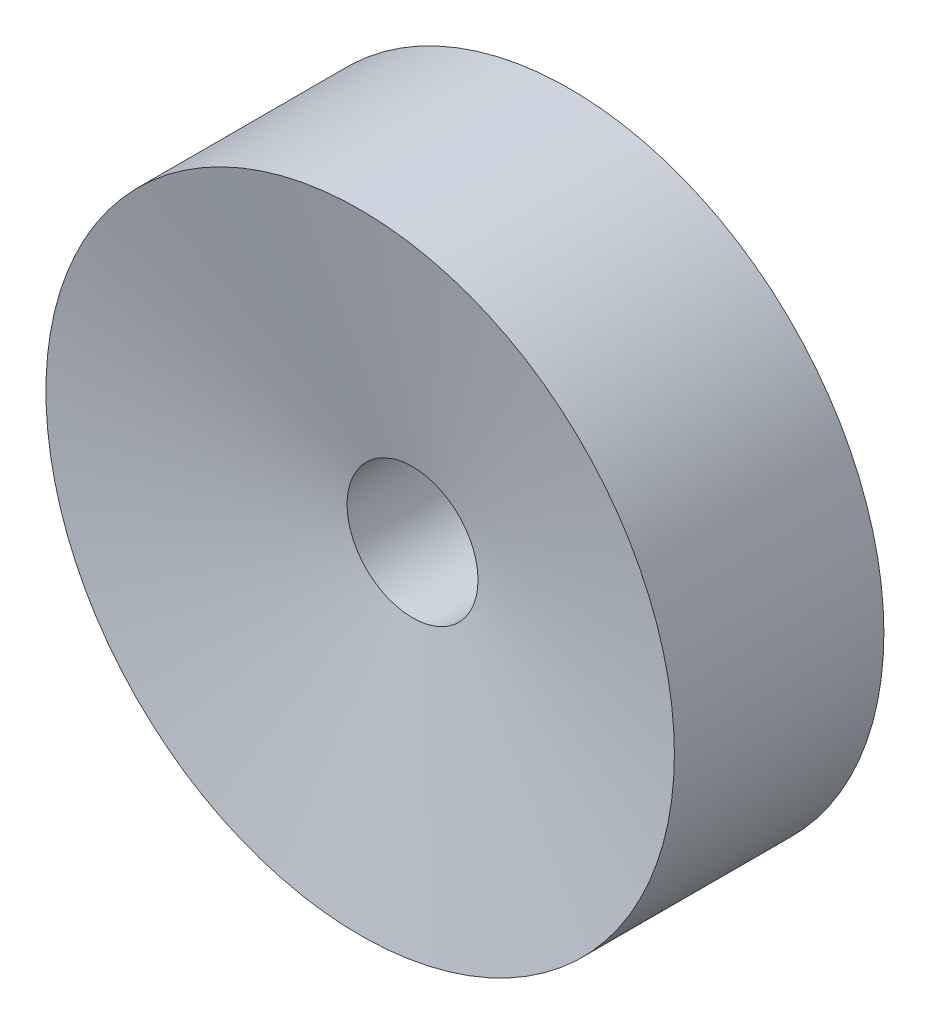
ISO-10303-21;
HEADER;
FILE_DESCRIPTION(('STEP AP214'),'2;1');
FILE_NAME('part.step','',(''),(''),'','','');
FILE_SCHEMA(('AUTOMOTIVE_DESIGN { 1 0 10303 214 1 1 1 1 }'));
ENDSEC;
DATA;
#1=APPLICATION_CONTEXT('core data for automotive mechanical design processes');
#2=APPLICATION_PROTOCOL_DEFINITION('international standard','automotive_design',2000,#1);
#3=PRODUCT_CONTEXT('',#1,'mechanical');
#4=PRODUCT('Part','Part','',(#3));
#5=PRODUCT_RELATED_PRODUCT_CATEGORY('part','',(#4));
#6=PRODUCT_DEFINITION_FORMATION('','',#4);
#7=PRODUCT_DEFINITION_CONTEXT('part definition',#1,'design');
#8=PRODUCT_DEFINITION('design','',#6,#7);
#9=PRODUCT_DEFINITION_SHAPE('','',#8);
#10=(LENGTH_UNIT() NAMED_UNIT(*) SI_UNIT(.MILLI.,.METRE.));
#11=(NAMED_UNIT(*) PLANE_ANGLE_UNIT() SI_UNIT($,.RADIAN.));
#12=(NAMED_UNIT(*) SI_UNIT($,.STERADIAN.) SOLID_ANGLE_UNIT());
#13=UNCERTAINTY_MEASURE_WITH_UNIT(LENGTH_MEASURE(1.E-05),#10,'distance_accuracy_value','');
#14=(GEOMETRIC_REPRESENTATION_CONTEXT(3) GLOBAL_UNCERTAINTY_ASSIGNED_CONTEXT((#13)) GLOBAL_UNIT_ASSIGNED_CONTEXT((#10,
#11,#12)) REPRESENTATION_CONTEXT('',''));
#15=CARTESIAN_POINT('',(0.,0.,0.));
#16=DIRECTION('',(0.,0.,1.));
#17=DIRECTION('',(1.,0.,0.));
#18=AXIS2_PLACEMENT_3D('',#15,#16,#17);
#19=CARTESIAN_POINT('',(0.,0.,25.4));
#20=DIRECTION('',(0.,0.,1.));
#21=DIRECTION('',(1.,0.,0.));
#22=AXIS2_PLACEMENT_3D('',#19,#20,#21);
#23=CONICAL_SURFACE('',#22,76.2,1.36330010035969);
#24=CARTESIAN_POINT('',(0.,0.,12.7));
#25=DIRECTION('',(0.,0.,1.));
#26=DIRECTION('',(1.,0.,0.));
#27=AXIS2_PLACEMENT_3D('',#24,#25,#26);
#28=CIRCLE('',#27,15.875);
#29=CARTESIAN_POINT('',(15.875,0.,12.7));
#30=VERTEX_POINT('',#29);
#31=EDGE_CURVE('E45',#30,#30,#28,.T.);
#32=CARTESIAN_POINT('',(0.,0.,25.4));
#33=DIRECTION('',(0.,0.,1.));
#34=DIRECTION('',(1.,0.,0.));
#35=AXIS2_PLACEMENT_3D('',#32,#33,#34);
#36=CIRCLE('',#35,76.2);
#37=CARTESIAN_POINT('',(76.2,0.,25.4));
#38=VERTEX_POINT('',#37);
#39=EDGE_CURVE('E10',#38,#38,#36,.T.);
#40=CARTESIAN_POINT('',(15.875,0.,12.7));
#41=CARTESIAN_POINT('',(16.5033854166667,0.,12.8322916666667));
#42=CARTESIAN_POINT('',(17.1317708333333,0.,12.9645833333333));
#43=CARTESIAN_POINT('',(18.3885416666667,0.,13.2291666666667));
#44=CARTESIAN_POINT('',(19.0169270833333,0.,13.3614583333333));
#45=CARTESIAN_POINT('',(20.2736979166667,0.,13.6260416666667));
#46=CARTESIAN_POINT('',(20.9020833333333,0.,13.7583333333333));
#47=CARTESIAN_POINT('',(22.1588541666667,0.,14.0229166666667));
#48=CARTESIAN_POINT('',(22.7872395833333,0.,14.1552083333333));
#49=CARTESIAN_POINT('',(24.0440104166667,0.,14.4197916666667));
#50=CARTESIAN_POINT('',(24.6723958333333,0.,14.5520833333333));
#51=CARTESIAN_POINT('',(25.9291666666667,0.,14.8166666666667));
#52=CARTESIAN_POINT('',(26.5575520833333,0.,14.9489583333333));
#53=CARTESIAN_POINT('',(27.8143229166667,0.,15.2135416666667));
#54=CARTESIAN_POINT('',(28.4427083333333,0.,15.3458333333333));
#55=CARTESIAN_POINT('',(29.6994791666667,0.,15.6104166666667));
#56=CARTESIAN_POINT('',(30.3278645833333,0.,15.7427083333333));
#57=CARTESIAN_POINT('',(31.5846354166667,0.,16.0072916666667));
#58=CARTESIAN_POINT('',(32.2130208333333,0.,16.1395833333333));
#59=CARTESIAN_POINT('',(33.4697916666667,0.,16.4041666666667));
#60=CARTESIAN_POINT('',(34.0981770833333,0.,16.5364583333333));
#61=CARTESIAN_POINT('',(35.3549479166667,0.,16.8010416666667));
#62=CARTESIAN_POINT('',(35.9833333333333,0.,16.9333333333333));
#63=CARTESIAN_POINT('',(37.2401041666667,0.,17.1979166666667));
#64=CARTESIAN_POINT('',(37.8684895833333,0.,17.3302083333333));
#65=CARTESIAN_POINT('',(39.1252604166667,0.,17.5947916666667));
#66=CARTESIAN_POINT('',(39.7536458333333,0.,17.7270833333333));
#67=CARTESIAN_POINT('',(41.0104166666667,0.,17.9916666666667));
#68=CARTESIAN_POINT('',(41.6388020833333,0.,18.1239583333333));
#69=CARTESIAN_POINT('',(42.8955729166667,0.,18.3885416666667));
#70=CARTESIAN_POINT('',(43.5239583333333,0.,18.5208333333333));
#71=CARTESIAN_POINT('',(44.7807291666667,0.,18.7854166666667));
#72=CARTESIAN_POINT('',(45.4091145833333,0.,18.9177083333333));
#73=CARTESIAN_POINT('',(46.6658854166667,0.,19.1822916666667));
#74=CARTESIAN_POINT('',(47.2942708333333,0.,19.3145833333333));
#75=CARTESIAN_POINT('',(48.5510416666667,0.,19.5791666666667));
#76=CARTESIAN_POINT('',(49.1794270833333,0.,19.7114583333333));
#77=CARTESIAN_POINT('',(50.4361979166667,0.,19.9760416666667));
#78=CARTESIAN_POINT('',(51.0645833333333,0.,20.1083333333333));
#79=CARTESIAN_POINT('',(52.3213541666667,0.,20.3729166666667));
#80=CARTESIAN_POINT('',(52.9497395833333,0.,20.5052083333333));
#81=CARTESIAN_POINT('',(54.2065104166667,0.,20.7697916666667));
#82=CARTESIAN_POINT('',(54.8348958333333,0.,20.9020833333333));
#83=CARTESIAN_POINT('',(56.0916666666667,0.,21.1666666666667));
#84=CARTESIAN_POINT('',(56.7200520833333,0.,21.2989583333333));
#85=CARTESIAN_POINT('',(57.9768229166666,0.,21.5635416666667));
#86=CARTESIAN_POINT('',(58.6052083333333,0.,21.6958333333333));
#87=CARTESIAN_POINT('',(59.8619791666667,0.,21.9604166666667));
#88=CARTESIAN_POINT('',(60.4903645833333,0.,22.0927083333333));
#89=CARTESIAN_POINT('',(61.7471354166667,0.,22.3572916666667));
#90=CARTESIAN_POINT('',(62.3755208333333,0.,22.4895833333333));
#91=CARTESIAN_POINT('',(63.6322916666667,0.,22.7541666666667));
#92=CARTESIAN_POINT('',(64.2606770833333,0.,22.8864583333333));
#93=CARTESIAN_POINT('',(65.5174479166667,0.,23.1510416666667));
#94=CARTESIAN_POINT('',(66.1458333333333,0.,23.2833333333333));
#95=CARTESIAN_POINT('',(67.4026041666667,0.,23.5479166666667));
#96=CARTESIAN_POINT('',(68.0309895833333,0.,23.6802083333333));
#97=CARTESIAN_POINT('',(69.2877604166666,0.,23.9447916666667));
#98=CARTESIAN_POINT('',(69.9161458333333,0.,24.0770833333333));
#99=CARTESIAN_POINT('',(71.1729166666667,0.,24.3416666666667));
#100=CARTESIAN_POINT('',(71.8013020833333,0.,24.4739583333333));
#101=CARTESIAN_POINT('',(73.0580729166666,0.,24.7385416666667));
#102=CARTESIAN_POINT('',(73.6864583333333,0.,24.8708333333333));
#103=CARTESIAN_POINT('',(74.9432291666667,0.,25.1354166666667));
#104=CARTESIAN_POINT('',(75.5716145833333,0.,25.2677083333333));
#105=CARTESIAN_POINT('',(76.2,0.,25.4));
#106=B_SPLINE_CURVE_WITH_KNOTS('',3,(#40,#41,#42,#43,#44,#45,#46,#47,#48,#49,#50,#51,#52,#53,
#54,#55,#56,#57,#58,#59,#60,#61,#62,#63,#64,#65,#66,#67,#68,#69,#70,#71,#72,#73,#74,#75,#76,#77,
#78,#79,#80,#81,#82,#83,#84,#85,#86,#87,#88,#89,#90,#91,#92,#93,#94,#95,#96,#97,#98,#99,#100,
#101,#102,#103,#104,#105),.UNSPECIFIED.,.F.,.F.,(4,2,2,2,2,2,2,2,2,2,2,2,2,2,2,2,2,2,2,2,2,2,2,
2,2,2,2,2,2,2,2,2,4),(0.,1.92647965277058,3.85295930554117,5.77943895831175,7.70591861108232,
9.63239826385291,11.5588779166235,13.4853575693941,15.4118372221647,17.3383168749352,
19.2647965277058,21.1912761804764,23.117755833247,25.0442354860176,26.9707151387881,
28.8971947915587,30.8236744443293,32.7501540970999,34.6766337498705,36.603113402641,
38.5295930554116,40.4560727081822,42.3825523609528,44.3090320137234,46.235511666494,
48.1619913192646,50.0884709720351,52.0149506248057,53.9414302775763,55.8679099303469,
57.7943895831175,59.7208692358881,61.6473488886586),.UNSPECIFIED.);
#107=EDGE_CURVE('BSEAM31',#30,#38,#106,.T.);
#108=ORIENTED_EDGE('',*,*,#31,.F.);
#109=ORIENTED_EDGE('',*,*,#39,.T.);
#110=ORIENTED_EDGE('',*,*,#107,.T.);
#111=ORIENTED_EDGE('',*,*,#107,.F.);
#112=EDGE_LOOP('',(#108,#110,#109,#111));
#113=FACE_BOUND('',#112,.T.);
#114=ADVANCED_FACE('F31',(#113),#23,.F.);
#115=CARTESIAN_POINT('',(0.,0.,9.94651305765615));
#116=DIRECTION('',(0.,0.,1.));
#117=DIRECTION('',(1.,0.,0.));
#118=AXIS2_PLACEMENT_3D('',#115,#116,#117);
#119=CYLINDRICAL_SURFACE('',#118,76.2);
#120=ORIENTED_EDGE('',*,*,#39,.F.);
#121=EDGE_LOOP('',(#120));
#122=FACE_BOUND('',#121,.T.);
#123=CARTESIAN_POINT('',(0.,0.,-25.4));
#124=DIRECTION('',(0.,0.,1.));
#125=DIRECTION('',(1.,0.,0.));
#126=AXIS2_PLACEMENT_3D('',#123,#124,#125);
#127=CIRCLE('',#126,76.2);
#128=CARTESIAN_POINT('',(-76.2,0.,-25.4));
#129=VERTEX_POINT('',#128);
#130=EDGE_CURVE('E37',#129,#129,#127,.T.);
#131=ORIENTED_EDGE('',*,*,#130,.T.);
#132=EDGE_LOOP('',(#131));
#133=FACE_BOUND('',#132,.T.);
#134=ADVANCED_FACE('F54',(#122,#133),#119,.T.);
#135=CARTESIAN_POINT('',(0.,0.,-12.7));
#136=DIRECTION('',(0.,0.,-1.));
#137=DIRECTION('',(-1.,0.,0.));
#138=AXIS2_PLACEMENT_3D('',#135,#136,#137);
#139=CONICAL_SURFACE('',#138,15.875,1.36330010035969);
#140=CARTESIAN_POINT('',(0.,0.,-12.7));
#141=DIRECTION('',(0.,0.,1.));
#142=DIRECTION('',(1.,0.,0.));
#143=AXIS2_PLACEMENT_3D('',#140,#141,#142);
#144=CIRCLE('',#143,15.875);
#145=CARTESIAN_POINT('',(-15.875,0.,-12.7));
#146=VERTEX_POINT('',#145);
#147=EDGE_CURVE('E41',#146,#146,#144,.T.);
#148=CARTESIAN_POINT('',(-76.2,0.,-25.4));
#149=CARTESIAN_POINT('',(-75.5716145833333,0.,-25.2677083333333));
#150=CARTESIAN_POINT('',(-74.9432291666667,0.,-25.1354166666667));
#151=CARTESIAN_POINT('',(-73.6864583333334,0.,-24.8708333333333));
#152=CARTESIAN_POINT('',(-73.0580729166667,0.,-24.7385416666667));
#153=CARTESIAN_POINT('',(-71.8013020833333,0.,-24.4739583333333));
#154=CARTESIAN_POINT('',(-71.1729166666667,0.,-24.3416666666667));
#155=CARTESIAN_POINT('',(-69.9161458333333,0.,-24.0770833333333));
#156=CARTESIAN_POINT('',(-69.2877604166667,0.,-23.9447916666667));
#157=CARTESIAN_POINT('',(-68.0309895833333,0.,-23.6802083333333));
#158=CARTESIAN_POINT('',(-67.4026041666667,0.,-23.5479166666667));
#159=CARTESIAN_POINT('',(-66.1458333333333,0.,-23.2833333333333));
#160=CARTESIAN_POINT('',(-65.5174479166667,0.,-23.1510416666667));
#161=CARTESIAN_POINT('',(-64.2606770833333,0.,-22.8864583333333));
#162=CARTESIAN_POINT('',(-63.6322916666667,0.,-22.7541666666667));
#163=CARTESIAN_POINT('',(-62.3755208333333,0.,-22.4895833333333));
#164=CARTESIAN_POINT('',(-61.7471354166667,0.,-22.3572916666667));
#165=CARTESIAN_POINT('',(-60.4903645833333,0.,-22.0927083333333));
#166=CARTESIAN_POINT('',(-59.8619791666667,0.,-21.9604166666667));
#167=CARTESIAN_POINT('',(-58.6052083333333,0.,-21.6958333333333));
#168=CARTESIAN_POINT('',(-57.9768229166667,0.,-21.5635416666667));
#169=CARTESIAN_POINT('',(-56.7200520833333,0.,-21.2989583333333));
#170=CARTESIAN_POINT('',(-56.0916666666667,0.,-21.1666666666667));
#171=CARTESIAN_POINT('',(-54.8348958333333,0.,-20.9020833333333));
#172=CARTESIAN_POINT('',(-54.2065104166667,0.,-20.7697916666667));
#173=CARTESIAN_POINT('',(-52.9497395833333,0.,-20.5052083333333));
#174=CARTESIAN_POINT('',(-52.3213541666667,0.,-20.3729166666667));
#175=CARTESIAN_POINT('',(-51.0645833333333,0.,-20.1083333333333));
#176=CARTESIAN_POINT('',(-50.4361979166667,0.,-19.9760416666667));
#177=CARTESIAN_POINT('',(-49.1794270833333,0.,-19.7114583333333));
#178=CARTESIAN_POINT('',(-48.5510416666667,0.,-19.5791666666667));
#179=CARTESIAN_POINT('',(-47.2942708333333,0.,-19.3145833333333));
#180=CARTESIAN_POINT('',(-46.6658854166667,0.,-19.1822916666667));
#181=CARTESIAN_POINT('',(-45.4091145833333,0.,-18.9177083333333));
#182=CARTESIAN_POINT('',(-44.7807291666667,0.,-18.7854166666667));
#183=CARTESIAN_POINT('',(-43.5239583333333,0.,-18.5208333333333));
#184=CARTESIAN_POINT('',(-42.8955729166667,0.,-18.3885416666667));
#185=CARTESIAN_POINT('',(-41.6388020833333,0.,-18.1239583333333));
#186=CARTESIAN_POINT('',(-41.0104166666667,0.,-17.9916666666667));
#187=CARTESIAN_POINT('',(-39.7536458333333,0.,-17.7270833333333));
#188=CARTESIAN_POINT('',(-39.1252604166667,0.,-17.5947916666667));
#189=CARTESIAN_POINT('',(-37.8684895833333,0.,-17.3302083333333));
#190=CARTESIAN_POINT('',(-37.2401041666667,0.,-17.1979166666667));
#191=CARTESIAN_POINT('',(-35.9833333333333,0.,-16.9333333333333));
#192=CARTESIAN_POINT('',(-35.3549479166667,0.,-16.8010416666667));
#193=CARTESIAN_POINT('',(-34.0981770833333,0.,-16.5364583333333));
#194=CARTESIAN_POINT('',(-33.4697916666667,0.,-16.4041666666667));
#195=CARTESIAN_POINT('',(-32.2130208333333,0.,-16.1395833333333));
#196=CARTESIAN_POINT('',(-31.5846354166667,0.,-16.0072916666667));
#197=CARTESIAN_POINT('',(-30.3278645833333,0.,-15.7427083333333));
#198=CARTESIAN_POINT('',(-29.6994791666667,0.,-15.6104166666667));
#199=CARTESIAN_POINT('',(-28.4427083333333,0.,-15.3458333333333));
#200=CARTESIAN_POINT('',(-27.8143229166667,0.,-15.2135416666667));
#201=CARTESIAN_POINT('',(-26.5575520833333,0.,-14.9489583333333));
#202=CARTESIAN_POINT('',(-25.9291666666667,0.,-14.8166666666667));
#203=CARTESIAN_POINT('',(-24.6723958333333,0.,-14.5520833333333));
#204=CARTESIAN_POINT('',(-24.0440104166667,0.,-14.4197916666667));
#205=CARTESIAN_POINT('',(-22.7872395833333,0.,-14.1552083333333));
#206=CARTESIAN_POINT('',(-22.1588541666667,0.,-14.0229166666667));
#207=CARTESIAN_POINT('',(-20.9020833333333,0.,-13.7583333333333));
#208=CARTESIAN_POINT('',(-20.2736979166667,0.,-13.6260416666667));
#209=CARTESIAN_POINT('',(-19.0169270833333,0.,-13.3614583333333));
#210=CARTESIAN_POINT('',(-18.3885416666667,0.,-13.2291666666667));
#211=CARTESIAN_POINT('',(-17.1317708333333,0.,-12.9645833333333));
#212=CARTESIAN_POINT('',(-16.5033854166667,0.,-12.8322916666667));
#213=CARTESIAN_POINT('',(-15.875,0.,-12.7));
#214=B_SPLINE_CURVE_WITH_KNOTS('',3,(#148,#149,#150,#151,#152,#153,#154,#155,#156,#157,#158,
#159,#160,#161,#162,#163,#164,#165,#166,#167,#168,#169,#170,#171,#172,#173,#174,#175,#176,#177,
#178,#179,#180,#181,#182,#183,#184,#185,#186,#187,#188,#189,#190,#191,#192,#193,#194,#195,#196,
#197,#198,#199,#200,#201,#202,#203,#204,#205,#206,#207,#208,#209,#210,#211,#212,#213),
.UNSPECIFIED.,.F.,.F.,(4,2,2,2,2,2,2,2,2,2,2,2,2,2,2,2,2,2,2,2,2,2,2,2,2,2,2,2,2,2,2,2,4),(0.,
1.92647965277057,3.85295930554118,5.77943895831175,7.70591861108234,9.63239826385293,
11.5588779166235,13.4853575693941,15.4118372221647,17.3383168749352,19.2647965277058,
21.1912761804764,23.117755833247,25.0442354860176,26.9707151387882,28.8971947915587,
30.8236744443293,32.7501540970999,34.6766337498705,36.6031134026411,38.5295930554117,
40.4560727081822,42.3825523609528,44.3090320137234,46.235511666494,48.1619913192646,
50.0884709720352,52.0149506248058,53.9414302775763,55.8679099303469,57.7943895831175,
59.7208692358881,61.6473488886587),.UNSPECIFIED.);
#215=EDGE_CURVE('BSEAM58',#129,#146,#214,.T.);
#216=ORIENTED_EDGE('',*,*,#130,.F.);
#217=ORIENTED_EDGE('',*,*,#147,.T.);
#218=ORIENTED_EDGE('',*,*,#215,.T.);
#219=ORIENTED_EDGE('',*,*,#215,.F.);
#220=EDGE_LOOP('',(#216,#218,#217,#219));
#221=FACE_BOUND('',#220,.T.);
#222=ADVANCED_FACE('F58',(#221),#139,.F.);
#223=CARTESIAN_POINT('',(0.,0.,9.94651305765615));
#224=DIRECTION('',(0.,0.,1.));
#225=DIRECTION('',(1.,0.,0.));
#226=AXIS2_PLACEMENT_3D('',#223,#224,#225);
#227=CYLINDRICAL_SURFACE('',#226,15.875);
#228=ORIENTED_EDGE('',*,*,#147,.F.);
#229=EDGE_LOOP('',(#228));
#230=FACE_BOUND('',#229,.T.);
#231=ORIENTED_EDGE('',*,*,#31,.T.);
#232=EDGE_LOOP('',(#231));
#233=FACE_BOUND('',#232,.T.);
#234=ADVANCED_FACE('F51',(#230,#233),#227,.F.);
#235=CLOSED_SHELL('',(#114,#134,#222,#234));
#236=MANIFOLD_SOLID_BREP('B2',#235);
#237=ADVANCED_BREP_SHAPE_REPRESENTATION('',(#18,#236),#14);
#238=SHAPE_DEFINITION_REPRESENTATION(#9,#237);
ENDSEC;
END-ISO-10303-21;
